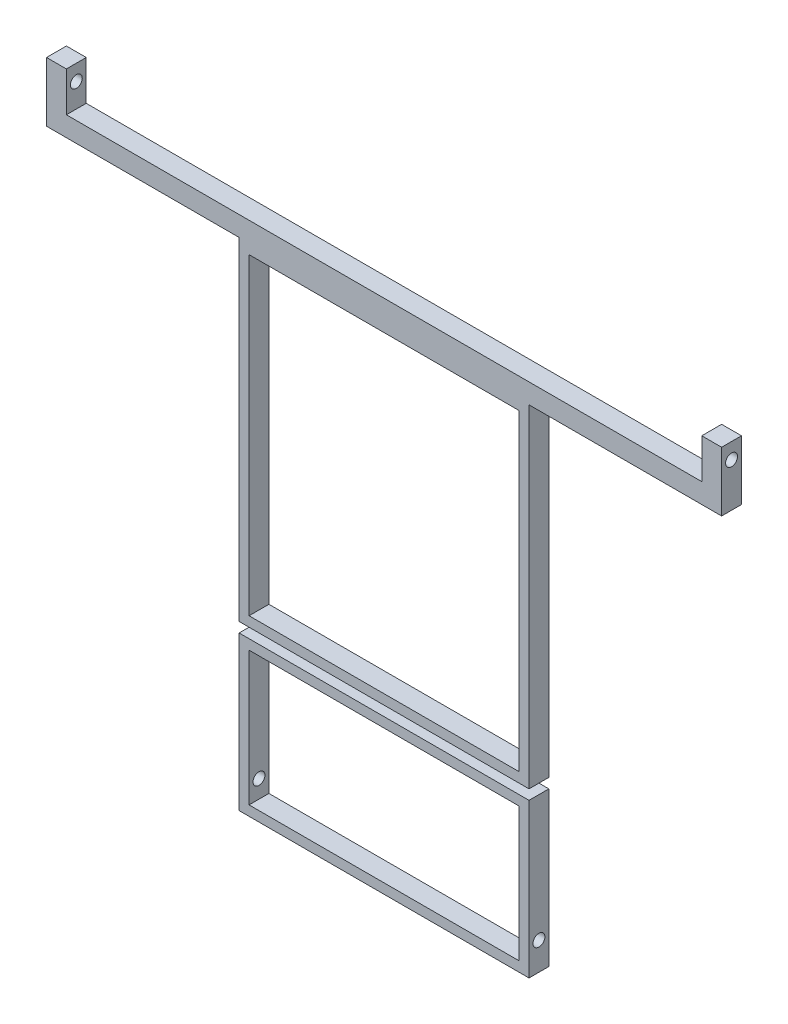
ISO-10303-21;
HEADER;
FILE_DESCRIPTION(('STEP AP214'),'2;1');
FILE_NAME('part.step','',(''),(''),'','','');
FILE_SCHEMA(('AUTOMOTIVE_DESIGN { 1 0 10303 214 1 1 1 1 }'));
ENDSEC;
DATA;
#1=APPLICATION_CONTEXT('core data for automotive mechanical design processes');
#2=APPLICATION_PROTOCOL_DEFINITION('international standard','automotive_design',2000,#1);
#3=PRODUCT_CONTEXT('',#1,'mechanical');
#4=PRODUCT('Part','Part','',(#3));
#5=PRODUCT_RELATED_PRODUCT_CATEGORY('part','',(#4));
#6=PRODUCT_DEFINITION_FORMATION('','',#4);
#7=PRODUCT_DEFINITION_CONTEXT('part definition',#1,'design');
#8=PRODUCT_DEFINITION('design','',#6,#7);
#9=PRODUCT_DEFINITION_SHAPE('','',#8);
#10=(LENGTH_UNIT() NAMED_UNIT(*) SI_UNIT(.MILLI.,.METRE.));
#11=(NAMED_UNIT(*) PLANE_ANGLE_UNIT() SI_UNIT($,.RADIAN.));
#12=(NAMED_UNIT(*) SI_UNIT($,.STERADIAN.) SOLID_ANGLE_UNIT());
#13=UNCERTAINTY_MEASURE_WITH_UNIT(LENGTH_MEASURE(1.E-05),#10,'distance_accuracy_value','');
#14=(GEOMETRIC_REPRESENTATION_CONTEXT(3) GLOBAL_UNCERTAINTY_ASSIGNED_CONTEXT((#13)) GLOBAL_UNIT_ASSIGNED_CONTEXT((#10,
#11,#12)) REPRESENTATION_CONTEXT('',''));
#15=CARTESIAN_POINT('',(0.,0.,0.));
#16=DIRECTION('',(0.,0.,1.));
#17=DIRECTION('',(1.,0.,0.));
#18=AXIS2_PLACEMENT_3D('',#15,#16,#17);
#19=CARTESIAN_POINT('',(0.,0.,25.));
#20=DIRECTION('',(0.,0.,1.));
#21=DIRECTION('',(1.,0.,0.));
#22=AXIS2_PLACEMENT_3D('',#19,#20,#21);
#23=PLANE('',#22);
#24=DIRECTION('',(-1.,0.,0.));
#25=VECTOR('',#24,1.);
#26=CARTESIAN_POINT('',(197.02687563104,-443.762397122992,25.));
#27=LINE('',#26,#25);
#28=CARTESIAN_POINT('',(582.5,-443.762397122992,25.));
#29=VERTEX_POINT('',#28);
#30=CARTESIAN_POINT('',(217.5,-443.762397122992,25.));
#31=VERTEX_POINT('',#30);
#32=EDGE_CURVE('E12',#29,#31,#27,.T.);
#33=ORIENTED_EDGE('',*,*,#32,.F.);
#34=DIRECTION('',(0.,1.,0.));
#35=VECTOR('',#34,1.);
#36=CARTESIAN_POINT('',(582.5,-650.,25.));
#37=LINE('',#36,#35);
#38=CARTESIAN_POINT('',(582.5,-25.,25.));
#39=VERTEX_POINT('',#38);
#40=EDGE_CURVE('E164',#29,#39,#37,.T.);
#41=ORIENTED_EDGE('',*,*,#40,.T.);
#42=DIRECTION('',(1.,0.,0.));
#43=VECTOR('',#42,1.);
#44=CARTESIAN_POINT('',(825.,-25.,25.));
#45=LINE('',#44,#43);
#46=CARTESIAN_POINT('',(825.,-25.,25.));
#47=VERTEX_POINT('',#46);
#48=EDGE_CURVE('E172',#39,#47,#45,.T.);
#49=ORIENTED_EDGE('',*,*,#48,.T.);
#50=DIRECTION('',(0.,1.,0.));
#51=VECTOR('',#50,1.);
#52=CARTESIAN_POINT('',(825.,50.,25.));
#53=LINE('',#52,#51);
#54=CARTESIAN_POINT('',(825.,50.,25.));
#55=VERTEX_POINT('',#54);
#56=EDGE_CURVE('E174',#47,#55,#53,.T.);
#57=ORIENTED_EDGE('',*,*,#56,.T.);
#58=DIRECTION('',(-1.,0.,0.));
#59=VECTOR('',#58,1.);
#60=CARTESIAN_POINT('',(800.,50.,25.));
#61=LINE('',#60,#59);
#62=CARTESIAN_POINT('',(800.,50.,25.));
#63=VERTEX_POINT('',#62);
#64=EDGE_CURVE('E259',#55,#63,#61,.T.);
#65=ORIENTED_EDGE('',*,*,#64,.T.);
#66=DIRECTION('',(0.,-1.,0.));
#67=VECTOR('',#66,1.);
#68=CARTESIAN_POINT('',(800.,0.,25.));
#69=LINE('',#68,#67);
#70=CARTESIAN_POINT('',(800.,0.,25.));
#71=VERTEX_POINT('',#70);
#72=EDGE_CURVE('E261',#63,#71,#69,.T.);
#73=ORIENTED_EDGE('',*,*,#72,.T.);
#74=DIRECTION('',(-1.,0.,0.));
#75=VECTOR('',#74,1.);
#76=CARTESIAN_POINT('',(0.,0.,25.));
#77=LINE('',#76,#75);
#78=CARTESIAN_POINT('',(0.,0.,25.));
#79=VERTEX_POINT('',#78);
#80=EDGE_CURVE('E254',#71,#79,#77,.T.);
#81=ORIENTED_EDGE('',*,*,#80,.T.);
#82=DIRECTION('',(0.,1.,0.));
#83=VECTOR('',#82,1.);
#84=CARTESIAN_POINT('',(0.,50.,25.));
#85=LINE('',#84,#83);
#86=CARTESIAN_POINT('',(0.,50.,25.));
#87=VERTEX_POINT('',#86);
#88=EDGE_CURVE('E250',#79,#87,#85,.T.);
#89=ORIENTED_EDGE('',*,*,#88,.T.);
#90=DIRECTION('',(-1.,0.,0.));
#91=VECTOR('',#90,1.);
#92=CARTESIAN_POINT('',(-25.,50.,25.));
#93=LINE('',#92,#91);
#94=CARTESIAN_POINT('',(-25.,50.,25.));
#95=VERTEX_POINT('',#94);
#96=EDGE_CURVE('E253',#87,#95,#93,.T.);
#97=ORIENTED_EDGE('',*,*,#96,.T.);
#98=DIRECTION('',(0.,-1.,0.));
#99=VECTOR('',#98,1.);
#100=CARTESIAN_POINT('',(-25.,-25.0000000000001,25.));
#101=LINE('',#100,#99);
#102=CARTESIAN_POINT('',(-25.,-25.0000000000001,25.));
#103=VERTEX_POINT('',#102);
#104=EDGE_CURVE('E256',#95,#103,#101,.T.);
#105=ORIENTED_EDGE('',*,*,#104,.T.);
#106=CARTESIAN_POINT('',(217.5,-25.0000000000001,25.));
#107=VERTEX_POINT('',#106);
#108=EDGE_CURVE('E176',#103,#107,#45,.T.);
#109=ORIENTED_EDGE('',*,*,#108,.T.);
#110=DIRECTION('',(0.,1.,0.));
#111=VECTOR('',#110,1.);
#112=CARTESIAN_POINT('',(217.5,-650.,25.));
#113=LINE('',#112,#111);
#114=EDGE_CURVE('E167',#31,#107,#113,.T.);
#115=ORIENTED_EDGE('',*,*,#114,.F.);
#116=EDGE_LOOP('',(#33,#41,#49,#57,#65,#73,#81,#89,#97,#105,#109,#115));
#117=FACE_BOUND('',#116,.T.);
#118=DIRECTION('',(-1.,0.,0.));
#119=VECTOR('',#118,1.);
#120=CARTESIAN_POINT('',(217.5,-431.262397122992,25.));
#121=LINE('',#120,#119);
#122=CARTESIAN_POINT('',(570.,-431.262397122992,25.));
#123=VERTEX_POINT('',#122);
#124=CARTESIAN_POINT('',(230.,-431.262397122992,25.));
#125=VERTEX_POINT('',#124);
#126=EDGE_CURVE('E209',#123,#125,#121,.T.);
#127=ORIENTED_EDGE('',*,*,#126,.T.);
#128=DIRECTION('',(0.,-1.,0.));
#129=VECTOR('',#128,1.);
#130=CARTESIAN_POINT('',(230.,-637.5,25.));
#131=LINE('',#130,#129);
#132=CARTESIAN_POINT('',(230.,-37.5,25.));
#133=VERTEX_POINT('',#132);
#134=EDGE_CURVE('E47',#133,#125,#131,.T.);
#135=ORIENTED_EDGE('',*,*,#134,.F.);
#136=DIRECTION('',(-1.,0.,0.));
#137=VECTOR('',#136,1.);
#138=CARTESIAN_POINT('',(230.,-37.5,25.));
#139=LINE('',#138,#137);
#140=CARTESIAN_POINT('',(570.,-37.5,25.));
#141=VERTEX_POINT('',#140);
#142=EDGE_CURVE('E203',#141,#133,#139,.T.);
#143=ORIENTED_EDGE('',*,*,#142,.F.);
#144=DIRECTION('',(0.,1.,0.));
#145=VECTOR('',#144,1.);
#146=CARTESIAN_POINT('',(570.,-637.5,25.));
#147=LINE('',#146,#145);
#148=EDGE_CURVE('E180',#123,#141,#147,.T.);
#149=ORIENTED_EDGE('',*,*,#148,.F.);
#150=EDGE_LOOP('',(#127,#135,#143,#149));
#151=FACE_BOUND('',#150,.T.);
#152=ADVANCED_FACE('F44',(#117,#151),#23,.T.);
#153=CARTESIAN_POINT('',(0.,0.,0.));
#154=DIRECTION('',(0.,0.,1.));
#155=DIRECTION('',(1.,0.,0.));
#156=AXIS2_PLACEMENT_3D('',#153,#154,#155);
#157=PLANE('',#156);
#158=DIRECTION('',(0.,-1.,0.));
#159=VECTOR('',#158,1.);
#160=CARTESIAN_POINT('',(230.,0.,0.));
#161=LINE('',#160,#159);
#162=CARTESIAN_POINT('',(230.,-37.5,0.));
#163=VERTEX_POINT('',#162);
#164=CARTESIAN_POINT('',(230.,-431.262397122992,0.));
#165=VERTEX_POINT('',#164);
#166=EDGE_CURVE('E212',#163,#165,#161,.T.);
#167=ORIENTED_EDGE('',*,*,#166,.T.);
#168=DIRECTION('',(-1.,0.,0.));
#169=VECTOR('',#168,1.);
#170=CARTESIAN_POINT('',(217.5,-431.262397122992,0.));
#171=LINE('',#170,#169);
#172=CARTESIAN_POINT('',(570.,-431.262397122992,0.));
#173=VERTEX_POINT('',#172);
#174=EDGE_CURVE('E205',#173,#165,#171,.T.);
#175=ORIENTED_EDGE('',*,*,#174,.F.);
#176=DIRECTION('',(0.,1.,0.));
#177=VECTOR('',#176,1.);
#178=CARTESIAN_POINT('',(570.,0.,0.));
#179=LINE('',#178,#177);
#180=CARTESIAN_POINT('',(570.,-37.5,0.));
#181=VERTEX_POINT('',#180);
#182=EDGE_CURVE('E219',#173,#181,#179,.T.);
#183=ORIENTED_EDGE('',*,*,#182,.T.);
#184=DIRECTION('',(-1.,0.,0.));
#185=VECTOR('',#184,1.);
#186=CARTESIAN_POINT('',(0.,-37.5,0.));
#187=LINE('',#186,#185);
#188=EDGE_CURVE('E216',#181,#163,#187,.T.);
#189=ORIENTED_EDGE('',*,*,#188,.T.);
#190=EDGE_LOOP('',(#167,#175,#183,#189));
#191=FACE_BOUND('',#190,.T.);
#192=DIRECTION('',(0.,1.,0.));
#193=VECTOR('',#192,1.);
#194=CARTESIAN_POINT('',(582.5,-650.,0.));
#195=LINE('',#194,#193);
#196=CARTESIAN_POINT('',(582.5,-443.762397122992,0.));
#197=VERTEX_POINT('',#196);
#198=CARTESIAN_POINT('',(582.5,-25.,0.));
#199=VERTEX_POINT('',#198);
#200=EDGE_CURVE('E158',#197,#199,#195,.T.);
#201=ORIENTED_EDGE('',*,*,#200,.F.);
#202=DIRECTION('',(-1.,0.,0.));
#203=VECTOR('',#202,1.);
#204=CARTESIAN_POINT('',(197.02687563104,-443.762397122992,0.));
#205=LINE('',#204,#203);
#206=CARTESIAN_POINT('',(217.5,-443.762397122992,0.));
#207=VERTEX_POINT('',#206);
#208=EDGE_CURVE('E150',#197,#207,#205,.T.);
#209=ORIENTED_EDGE('',*,*,#208,.T.);
#210=DIRECTION('',(0.,1.,0.));
#211=VECTOR('',#210,1.);
#212=CARTESIAN_POINT('',(217.5,-650.,0.));
#213=LINE('',#212,#211);
#214=CARTESIAN_POINT('',(217.5,-25.0000000000001,0.));
#215=VERTEX_POINT('',#214);
#216=EDGE_CURVE('E213',#207,#215,#213,.T.);
#217=ORIENTED_EDGE('',*,*,#216,.T.);
#218=DIRECTION('',(1.,0.,0.));
#219=VECTOR('',#218,1.);
#220=CARTESIAN_POINT('',(825.,-25.,0.));
#221=LINE('',#220,#219);
#222=CARTESIAN_POINT('',(-25.,-25.0000000000001,0.));
#223=VERTEX_POINT('',#222);
#224=EDGE_CURVE('E188',#223,#215,#221,.T.);
#225=ORIENTED_EDGE('',*,*,#224,.F.);
#226=DIRECTION('',(0.,-1.,0.));
#227=VECTOR('',#226,1.);
#228=CARTESIAN_POINT('',(-25.,-25.0000000000001,0.));
#229=LINE('',#228,#227);
#230=CARTESIAN_POINT('',(-25.,50.,0.));
#231=VERTEX_POINT('',#230);
#232=EDGE_CURVE('E244',#231,#223,#229,.T.);
#233=ORIENTED_EDGE('',*,*,#232,.F.);
#234=DIRECTION('',(-1.,0.,0.));
#235=VECTOR('',#234,1.);
#236=CARTESIAN_POINT('',(-25.,50.,0.));
#237=LINE('',#236,#235);
#238=CARTESIAN_POINT('',(0.,50.,0.));
#239=VERTEX_POINT('',#238);
#240=EDGE_CURVE('E267',#239,#231,#237,.T.);
#241=ORIENTED_EDGE('',*,*,#240,.F.);
#242=DIRECTION('',(0.,1.,0.));
#243=VECTOR('',#242,1.);
#244=CARTESIAN_POINT('',(0.,50.,0.));
#245=LINE('',#244,#243);
#246=CARTESIAN_POINT('',(0.,0.,0.));
#247=VERTEX_POINT('',#246);
#248=EDGE_CURVE('E249',#247,#239,#245,.T.);
#249=ORIENTED_EDGE('',*,*,#248,.F.);
#250=DIRECTION('',(-1.,0.,0.));
#251=VECTOR('',#250,1.);
#252=CARTESIAN_POINT('',(0.,0.,0.));
#253=LINE('',#252,#251);
#254=CARTESIAN_POINT('',(800.,0.,0.));
#255=VERTEX_POINT('',#254);
#256=EDGE_CURVE('E281',#255,#247,#253,.T.);
#257=ORIENTED_EDGE('',*,*,#256,.F.);
#258=DIRECTION('',(0.,-1.,0.));
#259=VECTOR('',#258,1.);
#260=CARTESIAN_POINT('',(800.,0.,0.));
#261=LINE('',#260,#259);
#262=CARTESIAN_POINT('',(800.,50.,0.));
#263=VERTEX_POINT('',#262);
#264=EDGE_CURVE('E277',#263,#255,#261,.T.);
#265=ORIENTED_EDGE('',*,*,#264,.F.);
#266=DIRECTION('',(-1.,0.,0.));
#267=VECTOR('',#266,1.);
#268=CARTESIAN_POINT('',(800.,50.,0.));
#269=LINE('',#268,#267);
#270=CARTESIAN_POINT('',(825.,50.,0.));
#271=VERTEX_POINT('',#270);
#272=EDGE_CURVE('E274',#271,#263,#269,.T.);
#273=ORIENTED_EDGE('',*,*,#272,.F.);
#274=DIRECTION('',(0.,1.,0.));
#275=VECTOR('',#274,1.);
#276=CARTESIAN_POINT('',(825.,50.,0.));
#277=LINE('',#276,#275);
#278=CARTESIAN_POINT('',(825.,-25.,0.));
#279=VERTEX_POINT('',#278);
#280=EDGE_CURVE('E271',#279,#271,#277,.T.);
#281=ORIENTED_EDGE('',*,*,#280,.F.);
#282=EDGE_CURVE('E233',#199,#279,#221,.T.);
#283=ORIENTED_EDGE('',*,*,#282,.F.);
#284=EDGE_LOOP('',(#201,#209,#217,#225,#233,#241,#249,#257,#265,#273,#281,#283));
#285=FACE_BOUND('',#284,.T.);
#286=ADVANCED_FACE('F224',(#191,#285),#157,.F.);
#287=CARTESIAN_POINT('',(217.5,-650.,25.));
#288=DIRECTION('',(1.,0.,0.));
#289=DIRECTION('',(0.,1.,0.));
#290=AXIS2_PLACEMENT_3D('',#287,#288,#289);
#291=PLANE('',#290);
#292=ORIENTED_EDGE('',*,*,#216,.F.);
#293=DIRECTION('',(0.,0.,1.));
#294=VECTOR('',#293,1.);
#295=CARTESIAN_POINT('',(217.5,-443.762397122992,25.));
#296=LINE('',#295,#294);
#297=EDGE_CURVE('E61',#207,#31,#296,.T.);
#298=ORIENTED_EDGE('',*,*,#297,.T.);
#299=ORIENTED_EDGE('',*,*,#114,.T.);
#300=DIRECTION('',(0.,0.,-1.));
#301=VECTOR('',#300,1.);
#302=CARTESIAN_POINT('',(217.5,-25.0000000000001,25.));
#303=LINE('',#302,#301);
#304=EDGE_CURVE('E159',#107,#215,#303,.T.);
#305=ORIENTED_EDGE('',*,*,#304,.T.);
#306=EDGE_LOOP('',(#292,#298,#299,#305));
#307=FACE_BOUND('',#306,.T.);
#308=ADVANCED_FACE('F235',(#307),#291,.F.);
#309=CARTESIAN_POINT('',(582.5,-650.,25.));
#310=DIRECTION('',(-1.,0.,0.));
#311=DIRECTION('',(0.,-1.,0.));
#312=AXIS2_PLACEMENT_3D('',#309,#310,#311);
#313=PLANE('',#312);
#314=ORIENTED_EDGE('',*,*,#40,.F.);
#315=DIRECTION('',(0.,0.,-1.));
#316=VECTOR('',#315,1.);
#317=CARTESIAN_POINT('',(582.5,-443.762397122992,25.));
#318=LINE('',#317,#316);
#319=EDGE_CURVE('E152',#29,#197,#318,.T.);
#320=ORIENTED_EDGE('',*,*,#319,.T.);
#321=ORIENTED_EDGE('',*,*,#200,.T.);
#322=DIRECTION('',(0.,0.,1.));
#323=VECTOR('',#322,1.);
#324=CARTESIAN_POINT('',(582.5,-25.,25.));
#325=LINE('',#324,#323);
#326=EDGE_CURVE('E171',#199,#39,#325,.T.);
#327=ORIENTED_EDGE('',*,*,#326,.T.);
#328=EDGE_LOOP('',(#314,#320,#321,#327));
#329=FACE_BOUND('',#328,.T.);
#330=ADVANCED_FACE('F169',(#329),#313,.F.);
#331=CARTESIAN_POINT('',(230.,-637.5,-600.));
#332=DIRECTION('',(-1.,0.,0.));
#333=DIRECTION('',(0.,0.,1.));
#334=AXIS2_PLACEMENT_3D('',#331,#332,#333);
#335=PLANE('',#334);
#336=DIRECTION('',(0.,0.,1.));
#337=VECTOR('',#336,1.);
#338=CARTESIAN_POINT('',(230.,-431.262397122992,-600.));
#339=LINE('',#338,#337);
#340=EDGE_CURVE('E206',#165,#125,#339,.T.);
#341=ORIENTED_EDGE('',*,*,#340,.F.);
#342=ORIENTED_EDGE('',*,*,#166,.F.);
#343=DIRECTION('',(0.,0.,1.));
#344=VECTOR('',#343,1.);
#345=CARTESIAN_POINT('',(230.,-37.5,-600.));
#346=LINE('',#345,#344);
#347=EDGE_CURVE('E191',#163,#133,#346,.T.);
#348=ORIENTED_EDGE('',*,*,#347,.T.);
#349=ORIENTED_EDGE('',*,*,#134,.T.);
#350=EDGE_LOOP('',(#341,#342,#348,#349));
#351=FACE_BOUND('',#350,.T.);
#352=ADVANCED_FACE('F322',(#351),#335,.F.);
#353=CARTESIAN_POINT('',(570.,-637.5,-600.));
#354=DIRECTION('',(1.,0.,0.));
#355=DIRECTION('',(0.,0.,-1.));
#356=AXIS2_PLACEMENT_3D('',#353,#354,#355);
#357=PLANE('',#356);
#358=DIRECTION('',(0.,0.,-1.));
#359=VECTOR('',#358,1.);
#360=CARTESIAN_POINT('',(570.,-431.262397122992,-600.));
#361=LINE('',#360,#359);
#362=EDGE_CURVE('E53',#123,#173,#361,.T.);
#363=ORIENTED_EDGE('',*,*,#362,.F.);
#364=ORIENTED_EDGE('',*,*,#148,.T.);
#365=DIRECTION('',(0.,0.,1.));
#366=VECTOR('',#365,1.);
#367=CARTESIAN_POINT('',(570.,-37.5,-600.));
#368=LINE('',#367,#366);
#369=EDGE_CURVE('E201',#181,#141,#368,.T.);
#370=ORIENTED_EDGE('',*,*,#369,.F.);
#371=ORIENTED_EDGE('',*,*,#182,.F.);
#372=EDGE_LOOP('',(#363,#364,#370,#371));
#373=FACE_BOUND('',#372,.T.);
#374=ADVANCED_FACE('F305',(#373),#357,.F.);
#375=CARTESIAN_POINT('',(825.,-25.,25.));
#376=DIRECTION('',(0.,1.,0.));
#377=DIRECTION('',(-1.,0.,0.));
#378=AXIS2_PLACEMENT_3D('',#375,#376,#377);
#379=PLANE('',#378);
#380=ORIENTED_EDGE('',*,*,#304,.F.);
#381=ORIENTED_EDGE('',*,*,#108,.F.);
#382=DIRECTION('',(0.,0.,-1.));
#383=VECTOR('',#382,1.);
#384=CARTESIAN_POINT('',(-25.,-25.0000000000001,25.));
#385=LINE('',#384,#383);
#386=EDGE_CURVE('E181',#103,#223,#385,.T.);
#387=ORIENTED_EDGE('',*,*,#386,.T.);
#388=ORIENTED_EDGE('',*,*,#224,.T.);
#389=EDGE_LOOP('',(#380,#381,#387,#388));
#390=FACE_BOUND('',#389,.T.);
#391=ADVANCED_FACE('F230',(#390),#379,.F.);
#392=ORIENTED_EDGE('',*,*,#326,.F.);
#393=ORIENTED_EDGE('',*,*,#282,.T.);
#394=DIRECTION('',(0.,0.,-1.));
#395=VECTOR('',#394,1.);
#396=CARTESIAN_POINT('',(825.,-25.,25.));
#397=LINE('',#396,#395);
#398=EDGE_CURVE('E273',#47,#279,#397,.T.);
#399=ORIENTED_EDGE('',*,*,#398,.F.);
#400=ORIENTED_EDGE('',*,*,#48,.F.);
#401=EDGE_LOOP('',(#392,#393,#399,#400));
#402=FACE_BOUND('',#401,.T.);
#403=ADVANCED_FACE('F357',(#402),#379,.F.);
#404=CARTESIAN_POINT('',(0.,50.,25.));
#405=DIRECTION('',(-1.,0.,0.));
#406=DIRECTION('',(0.,0.,1.));
#407=AXIS2_PLACEMENT_3D('',#404,#405,#406);
#408=PLANE('',#407);
#409=CARTESIAN_POINT('',(0.,30.0000000000013,12.5));
#410=DIRECTION('',(-1.,0.,0.));
#411=DIRECTION('',(0.,0.,1.));
#412=AXIS2_PLACEMENT_3D('',#409,#410,#411);
#413=CIRCLE('',#412,7.5);
#414=CARTESIAN_POINT('',(0.,30.0000000000013,20.));
#415=VERTEX_POINT('',#414);
#416=EDGE_CURVE('E246',#415,#415,#413,.T.);
#417=ORIENTED_EDGE('',*,*,#416,.T.);
#418=EDGE_LOOP('',(#417));
#419=FACE_BOUND('',#418,.T.);
#420=ORIENTED_EDGE('',*,*,#248,.T.);
#421=DIRECTION('',(0.,0.,-1.));
#422=VECTOR('',#421,1.);
#423=CARTESIAN_POINT('',(0.,50.,25.));
#424=LINE('',#423,#422);
#425=EDGE_CURVE('E245',#87,#239,#424,.T.);
#426=ORIENTED_EDGE('',*,*,#425,.F.);
#427=ORIENTED_EDGE('',*,*,#88,.F.);
#428=DIRECTION('',(0.,0.,-1.));
#429=VECTOR('',#428,1.);
#430=CARTESIAN_POINT('',(0.,0.,25.));
#431=LINE('',#430,#429);
#432=EDGE_CURVE('E266',#79,#247,#431,.T.);
#433=ORIENTED_EDGE('',*,*,#432,.T.);
#434=EDGE_LOOP('',(#420,#426,#427,#433));
#435=FACE_BOUND('',#434,.T.);
#436=ADVANCED_FACE('F364',(#419,#435),#408,.F.);
#437=CARTESIAN_POINT('',(-25.,50.,25.));
#438=DIRECTION('',(0.,-1.,0.));
#439=DIRECTION('',(0.,0.,-1.));
#440=AXIS2_PLACEMENT_3D('',#437,#438,#439);
#441=PLANE('',#440);
#442=ORIENTED_EDGE('',*,*,#240,.T.);
#443=DIRECTION('',(0.,0.,-1.));
#444=VECTOR('',#443,1.);
#445=CARTESIAN_POINT('',(-25.,50.,25.));
#446=LINE('',#445,#444);
#447=EDGE_CURVE('E269',#95,#231,#446,.T.);
#448=ORIENTED_EDGE('',*,*,#447,.F.);
#449=ORIENTED_EDGE('',*,*,#96,.F.);
#450=ORIENTED_EDGE('',*,*,#425,.T.);
#451=EDGE_LOOP('',(#442,#448,#449,#450));
#452=FACE_BOUND('',#451,.T.);
#453=ADVANCED_FACE('F360',(#452),#441,.F.);
#454=CARTESIAN_POINT('',(-25.,-25.0000000000001,25.));
#455=DIRECTION('',(1.,0.,0.));
#456=DIRECTION('',(0.,0.,-1.));
#457=AXIS2_PLACEMENT_3D('',#454,#455,#456);
#458=PLANE('',#457);
#459=CARTESIAN_POINT('',(-25.0000000000004,30.0000000000013,12.5));
#460=DIRECTION('',(1.,0.,0.));
#461=DIRECTION('',(0.,0.,-1.));
#462=AXIS2_PLACEMENT_3D('',#459,#460,#461);
#463=CIRCLE('',#462,7.5);
#464=CARTESIAN_POINT('',(-25.0000000000004,30.0000000000013,5.));
#465=VERTEX_POINT('',#464);
#466=EDGE_CURVE('E241',#465,#465,#463,.T.);
#467=ORIENTED_EDGE('',*,*,#466,.T.);
#468=EDGE_LOOP('',(#467));
#469=FACE_BOUND('',#468,.T.);
#470=ORIENTED_EDGE('',*,*,#232,.T.);
#471=ORIENTED_EDGE('',*,*,#386,.F.);
#472=ORIENTED_EDGE('',*,*,#104,.F.);
#473=ORIENTED_EDGE('',*,*,#447,.T.);
#474=EDGE_LOOP('',(#470,#471,#472,#473));
#475=FACE_BOUND('',#474,.T.);
#476=ADVANCED_FACE('F353',(#469,#475),#458,.F.);
#477=CARTESIAN_POINT('',(825.,50.,25.));
#478=DIRECTION('',(-1.,0.,0.));
#479=DIRECTION('',(0.,-1.,0.));
#480=AXIS2_PLACEMENT_3D('',#477,#478,#479);
#481=PLANE('',#480);
#482=CARTESIAN_POINT('',(825.,30.,12.5));
#483=DIRECTION('',(1.,0.,0.));
#484=DIRECTION('',(0.,1.,0.));
#485=AXIS2_PLACEMENT_3D('',#482,#483,#484);
#486=CIRCLE('',#485,7.5);
#487=CARTESIAN_POINT('',(825.,37.5,12.5));
#488=VERTEX_POINT('',#487);
#489=EDGE_CURVE('E237',#488,#488,#486,.T.);
#490=ORIENTED_EDGE('',*,*,#489,.F.);
#491=EDGE_LOOP('',(#490));
#492=FACE_BOUND('',#491,.T.);
#493=ORIENTED_EDGE('',*,*,#280,.T.);
#494=DIRECTION('',(0.,0.,-1.));
#495=VECTOR('',#494,1.);
#496=CARTESIAN_POINT('',(825.,50.,25.));
#497=LINE('',#496,#495);
#498=EDGE_CURVE('E276',#55,#271,#497,.T.);
#499=ORIENTED_EDGE('',*,*,#498,.F.);
#500=ORIENTED_EDGE('',*,*,#56,.F.);
#501=ORIENTED_EDGE('',*,*,#398,.T.);
#502=EDGE_LOOP('',(#493,#499,#500,#501));
#503=FACE_BOUND('',#502,.T.);
#504=ADVANCED_FACE('F349',(#492,#503),#481,.F.);
#505=CARTESIAN_POINT('',(800.,50.,25.));
#506=DIRECTION('',(0.,-1.,0.));
#507=DIRECTION('',(0.,0.,-1.));
#508=AXIS2_PLACEMENT_3D('',#505,#506,#507);
#509=PLANE('',#508);
#510=ORIENTED_EDGE('',*,*,#272,.T.);
#511=DIRECTION('',(0.,0.,-1.));
#512=VECTOR('',#511,1.);
#513=CARTESIAN_POINT('',(800.,50.,25.));
#514=LINE('',#513,#512);
#515=EDGE_CURVE('E279',#63,#263,#514,.T.);
#516=ORIENTED_EDGE('',*,*,#515,.F.);
#517=ORIENTED_EDGE('',*,*,#64,.F.);
#518=ORIENTED_EDGE('',*,*,#498,.T.);
#519=EDGE_LOOP('',(#510,#516,#517,#518));
#520=FACE_BOUND('',#519,.T.);
#521=ADVANCED_FACE('F345',(#520),#509,.F.);
#522=CARTESIAN_POINT('',(800.,0.,25.));
#523=DIRECTION('',(1.,0.,0.));
#524=DIRECTION('',(0.,0.,-1.));
#525=AXIS2_PLACEMENT_3D('',#522,#523,#524);
#526=PLANE('',#525);
#527=CARTESIAN_POINT('',(800.000000000001,30.0000000000001,12.5));
#528=DIRECTION('',(1.,0.,0.));
#529=DIRECTION('',(0.,0.,-1.));
#530=AXIS2_PLACEMENT_3D('',#527,#528,#529);
#531=CIRCLE('',#530,7.5);
#532=CARTESIAN_POINT('',(800.000000000001,30.0000000000001,5.));
#533=VERTEX_POINT('',#532);
#534=EDGE_CURVE('E280',#533,#533,#531,.T.);
#535=ORIENTED_EDGE('',*,*,#534,.T.);
#536=EDGE_LOOP('',(#535));
#537=FACE_BOUND('',#536,.T.);
#538=ORIENTED_EDGE('',*,*,#264,.T.);
#539=DIRECTION('',(0.,0.,-1.));
#540=VECTOR('',#539,1.);
#541=CARTESIAN_POINT('',(800.,0.,25.));
#542=LINE('',#541,#540);
#543=EDGE_CURVE('E240',#71,#255,#542,.T.);
#544=ORIENTED_EDGE('',*,*,#543,.F.);
#545=ORIENTED_EDGE('',*,*,#72,.F.);
#546=ORIENTED_EDGE('',*,*,#515,.T.);
#547=EDGE_LOOP('',(#538,#544,#545,#546));
#548=FACE_BOUND('',#547,.T.);
#549=ADVANCED_FACE('F341',(#537,#548),#526,.F.);
#550=CARTESIAN_POINT('',(0.,0.,25.));
#551=DIRECTION('',(0.,-1.,0.));
#552=DIRECTION('',(0.,0.,-1.));
#553=AXIS2_PLACEMENT_3D('',#550,#551,#552);
#554=PLANE('',#553);
#555=ORIENTED_EDGE('',*,*,#256,.T.);
#556=ORIENTED_EDGE('',*,*,#432,.F.);
#557=ORIENTED_EDGE('',*,*,#80,.F.);
#558=ORIENTED_EDGE('',*,*,#543,.T.);
#559=EDGE_LOOP('',(#555,#556,#557,#558));
#560=FACE_BOUND('',#559,.T.);
#561=ADVANCED_FACE('F338',(#560),#554,.F.);
#562=CARTESIAN_POINT('',(-9175.,30.0000000000148,12.5));
#563=DIRECTION('',(1.,0.,0.));
#564=DIRECTION('',(0.,1.,0.));
#565=AXIS2_PLACEMENT_3D('',#562,#563,#564);
#566=CYLINDRICAL_SURFACE('',#565,7.5);
#567=ORIENTED_EDGE('',*,*,#489,.T.);
#568=EDGE_LOOP('',(#567));
#569=FACE_BOUND('',#568,.T.);
#570=ORIENTED_EDGE('',*,*,#534,.F.);
#571=EDGE_LOOP('',(#570));
#572=FACE_BOUND('',#571,.T.);
#573=ADVANCED_FACE('F336',(#569,#572),#566,.F.);
#574=ORIENTED_EDGE('',*,*,#466,.F.);
#575=EDGE_LOOP('',(#574));
#576=FACE_BOUND('',#575,.T.);
#577=ORIENTED_EDGE('',*,*,#416,.F.);
#578=EDGE_LOOP('',(#577));
#579=FACE_BOUND('',#578,.T.);
#580=ADVANCED_FACE('F333',(#576,#579),#566,.F.);
#581=CARTESIAN_POINT('',(230.,-37.5,-600.));
#582=DIRECTION('',(0.,1.,0.));
#583=DIRECTION('',(-1.,0.,0.));
#584=AXIS2_PLACEMENT_3D('',#581,#582,#583);
#585=PLANE('',#584);
#586=ORIENTED_EDGE('',*,*,#369,.T.);
#587=ORIENTED_EDGE('',*,*,#142,.T.);
#588=ORIENTED_EDGE('',*,*,#347,.F.);
#589=ORIENTED_EDGE('',*,*,#188,.F.);
#590=EDGE_LOOP('',(#586,#587,#588,#589));
#591=FACE_BOUND('',#590,.T.);
#592=ADVANCED_FACE('F309',(#591),#585,.F.);
#593=CARTESIAN_POINT('',(217.5,-431.262397122992,25.));
#594=DIRECTION('',(0.,-1.,0.));
#595=DIRECTION('',(0.,0.,-1.));
#596=AXIS2_PLACEMENT_3D('',#593,#594,#595);
#597=PLANE('',#596);
#598=ORIENTED_EDGE('',*,*,#174,.T.);
#599=ORIENTED_EDGE('',*,*,#340,.T.);
#600=ORIENTED_EDGE('',*,*,#126,.F.);
#601=ORIENTED_EDGE('',*,*,#362,.T.);
#602=EDGE_LOOP('',(#598,#599,#600,#601));
#603=FACE_BOUND('',#602,.T.);
#604=ADVANCED_FACE('F304',(#603),#597,.F.);
#605=CARTESIAN_POINT('',(197.02687563104,-443.762397122992,0.));
#606=DIRECTION('',(0.,1.,0.));
#607=DIRECTION('',(0.,0.,1.));
#608=AXIS2_PLACEMENT_3D('',#605,#606,#607);
#609=PLANE('',#608);
#610=ORIENTED_EDGE('',*,*,#208,.F.);
#611=ORIENTED_EDGE('',*,*,#319,.F.);
#612=ORIENTED_EDGE('',*,*,#32,.T.);
#613=ORIENTED_EDGE('',*,*,#297,.F.);
#614=EDGE_LOOP('',(#610,#611,#612,#613));
#615=FACE_BOUND('',#614,.T.);
#616=ADVANCED_FACE('F154',(#615),#609,.F.);
#617=CLOSED_SHELL('',(#152,#286,#308,#330,#352,#374,#391,#403,#436,#453,#476,#504,#521,#549,
#561,#573,#580,#592,#604,#616));
#618=MANIFOLD_SOLID_BREP('B2',#617);
#619=CARTESIAN_POINT('',(230.,-637.5,-600.));
#620=DIRECTION('',(0.,-1.,0.));
#621=DIRECTION('',(0.,0.,-1.));
#622=AXIS2_PLACEMENT_3D('',#619,#620,#621);
#623=PLANE('',#622);
#624=DIRECTION('',(0.,0.,1.));
#625=VECTOR('',#624,1.);
#626=CARTESIAN_POINT('',(230.,-637.5,-600.));
#627=LINE('',#626,#625);
#628=CARTESIAN_POINT('',(230.,-637.5,0.));
#629=VERTEX_POINT('',#628);
#630=CARTESIAN_POINT('',(230.,-637.5,25.));
#631=VERTEX_POINT('',#630);
#632=EDGE_CURVE('E657',#629,#631,#627,.T.);
#633=ORIENTED_EDGE('',*,*,#632,.T.);
#634=DIRECTION('',(1.,0.,0.));
#635=VECTOR('',#634,1.);
#636=CARTESIAN_POINT('',(230.,-637.5,25.));
#637=LINE('',#636,#635);
#638=CARTESIAN_POINT('',(570.,-637.5,25.));
#639=VERTEX_POINT('',#638);
#640=EDGE_CURVE('E658',#631,#639,#637,.T.);
#641=ORIENTED_EDGE('',*,*,#640,.T.);
#642=DIRECTION('',(0.,0.,1.));
#643=VECTOR('',#642,1.);
#644=CARTESIAN_POINT('',(570.,-637.5,-600.));
#645=LINE('',#644,#643);
#646=CARTESIAN_POINT('',(570.,-637.5,0.));
#647=VERTEX_POINT('',#646);
#648=EDGE_CURVE('E655',#647,#639,#645,.T.);
#649=ORIENTED_EDGE('',*,*,#648,.F.);
#650=DIRECTION('',(1.,0.,0.));
#651=VECTOR('',#650,1.);
#652=CARTESIAN_POINT('',(0.,-637.5,0.));
#653=LINE('',#652,#651);
#654=EDGE_CURVE('E631',#629,#647,#653,.T.);
#655=ORIENTED_EDGE('',*,*,#654,.F.);
#656=EDGE_LOOP('',(#633,#641,#649,#655));
#657=FACE_BOUND('',#656,.T.);
#658=ADVANCED_FACE('F532',(#657),#623,.F.);
#659=CARTESIAN_POINT('',(230.,-637.5,-600.));
#660=DIRECTION('',(-1.,0.,0.));
#661=DIRECTION('',(0.,0.,1.));
#662=AXIS2_PLACEMENT_3D('',#659,#660,#661);
#663=PLANE('',#662);
#664=CARTESIAN_POINT('',(230.,-615.,12.5));
#665=DIRECTION('',(-1.,0.,0.));
#666=DIRECTION('',(0.,0.,1.));
#667=AXIS2_PLACEMENT_3D('',#664,#665,#666);
#668=CIRCLE('',#667,7.5);
#669=CARTESIAN_POINT('',(230.,-615.,20.));
#670=VERTEX_POINT('',#669);
#671=EDGE_CURVE('E614',#670,#670,#668,.T.);
#672=ORIENTED_EDGE('',*,*,#671,.T.);
#673=EDGE_LOOP('',(#672));
#674=FACE_BOUND('',#673,.T.);
#675=DIRECTION('',(0.,0.,-1.));
#676=VECTOR('',#675,1.);
#677=CARTESIAN_POINT('',(230.,-468.762397122992,-600.));
#678=LINE('',#677,#676);
#679=CARTESIAN_POINT('',(230.,-468.762397122992,25.));
#680=VERTEX_POINT('',#679);
#681=CARTESIAN_POINT('',(230.,-468.762397122992,0.));
#682=VERTEX_POINT('',#681);
#683=EDGE_CURVE('E652',#680,#682,#678,.T.);
#684=ORIENTED_EDGE('',*,*,#683,.F.);
#685=DIRECTION('',(0.,-1.,0.));
#686=VECTOR('',#685,1.);
#687=CARTESIAN_POINT('',(230.,-637.5,25.));
#688=LINE('',#687,#686);
#689=EDGE_CURVE('E651',#680,#631,#688,.T.);
#690=ORIENTED_EDGE('',*,*,#689,.T.);
#691=ORIENTED_EDGE('',*,*,#632,.F.);
#692=DIRECTION('',(0.,-1.,0.));
#693=VECTOR('',#692,1.);
#694=CARTESIAN_POINT('',(230.,0.,0.));
#695=LINE('',#694,#693);
#696=EDGE_CURVE('E636',#682,#629,#695,.T.);
#697=ORIENTED_EDGE('',*,*,#696,.F.);
#698=EDGE_LOOP('',(#684,#690,#691,#697));
#699=FACE_BOUND('',#698,.T.);
#700=ADVANCED_FACE('F682',(#674,#699),#663,.F.);
#701=CARTESIAN_POINT('',(217.5,-468.762397122992,25.));
#702=DIRECTION('',(0.,1.,0.));
#703=DIRECTION('',(0.,0.,1.));
#704=AXIS2_PLACEMENT_3D('',#701,#702,#703);
#705=PLANE('',#704);
#706=DIRECTION('',(1.,0.,0.));
#707=VECTOR('',#706,1.);
#708=CARTESIAN_POINT('',(217.5,-468.762397122992,25.));
#709=LINE('',#708,#707);
#710=CARTESIAN_POINT('',(570.,-468.762397122992,25.));
#711=VERTEX_POINT('',#710);
#712=EDGE_CURVE('E642',#680,#711,#709,.T.);
#713=ORIENTED_EDGE('',*,*,#712,.F.);
#714=ORIENTED_EDGE('',*,*,#683,.T.);
#715=DIRECTION('',(1.,0.,0.));
#716=VECTOR('',#715,1.);
#717=CARTESIAN_POINT('',(217.5,-468.762397122992,0.));
#718=LINE('',#717,#716);
#719=CARTESIAN_POINT('',(570.,-468.762397122992,0.));
#720=VERTEX_POINT('',#719);
#721=EDGE_CURVE('E555',#682,#720,#718,.T.);
#722=ORIENTED_EDGE('',*,*,#721,.T.);
#723=DIRECTION('',(0.,0.,1.));
#724=VECTOR('',#723,1.);
#725=CARTESIAN_POINT('',(570.,-468.762397122992,-600.));
#726=LINE('',#725,#724);
#727=EDGE_CURVE('E541',#720,#711,#726,.T.);
#728=ORIENTED_EDGE('',*,*,#727,.T.);
#729=EDGE_LOOP('',(#713,#714,#722,#728));
#730=FACE_BOUND('',#729,.T.);
#731=ADVANCED_FACE('F641',(#730),#705,.F.);
#732=CARTESIAN_POINT('',(570.,-637.5,-600.));
#733=DIRECTION('',(1.,0.,0.));
#734=DIRECTION('',(0.,0.,-1.));
#735=AXIS2_PLACEMENT_3D('',#732,#733,#734);
#736=PLANE('',#735);
#737=CARTESIAN_POINT('',(570.,-615.,12.5));
#738=DIRECTION('',(1.,0.,0.));
#739=DIRECTION('',(0.,0.,-1.));
#740=AXIS2_PLACEMENT_3D('',#737,#738,#739);
#741=CIRCLE('',#740,7.5);
#742=CARTESIAN_POINT('',(570.,-615.,5.));
#743=VERTEX_POINT('',#742);
#744=EDGE_CURVE('E713',#743,#743,#741,.T.);
#745=ORIENTED_EDGE('',*,*,#744,.T.);
#746=EDGE_LOOP('',(#745));
#747=FACE_BOUND('',#746,.T.);
#748=ORIENTED_EDGE('',*,*,#727,.F.);
#749=DIRECTION('',(0.,1.,0.));
#750=VECTOR('',#749,1.);
#751=CARTESIAN_POINT('',(570.,0.,0.));
#752=LINE('',#751,#750);
#753=EDGE_CURVE('E634',#647,#720,#752,.T.);
#754=ORIENTED_EDGE('',*,*,#753,.F.);
#755=ORIENTED_EDGE('',*,*,#648,.T.);
#756=DIRECTION('',(0.,1.,0.));
#757=VECTOR('',#756,1.);
#758=CARTESIAN_POINT('',(570.,-637.5,25.));
#759=LINE('',#758,#757);
#760=EDGE_CURVE('E650',#639,#711,#759,.T.);
#761=ORIENTED_EDGE('',*,*,#760,.T.);
#762=EDGE_LOOP('',(#748,#754,#755,#761));
#763=FACE_BOUND('',#762,.T.);
#764=ADVANCED_FACE('F654',(#747,#763),#736,.F.);
#765=CARTESIAN_POINT('',(0.,-650.,0.));
#766=DIRECTION('',(0.,-1.,0.));
#767=DIRECTION('',(1.,0.,0.));
#768=AXIS2_PLACEMENT_3D('',#765,#766,#767);
#769=PLANE('',#768);
#770=DIRECTION('',(0.,0.,-1.));
#771=VECTOR('',#770,1.);
#772=CARTESIAN_POINT('',(217.5,-650.,25.));
#773=LINE('',#772,#771);
#774=CARTESIAN_POINT('',(217.5,-650.,25.));
#775=VERTEX_POINT('',#774);
#776=CARTESIAN_POINT('',(217.5,-650.,0.));
#777=VERTEX_POINT('',#776);
#778=EDGE_CURVE('E618',#775,#777,#773,.T.);
#779=ORIENTED_EDGE('',*,*,#778,.T.);
#780=DIRECTION('',(1.,0.,0.));
#781=VECTOR('',#780,1.);
#782=CARTESIAN_POINT('',(217.5,-650.,0.));
#783=LINE('',#782,#781);
#784=CARTESIAN_POINT('',(582.5,-650.,0.));
#785=VERTEX_POINT('',#784);
#786=EDGE_CURVE('E667',#777,#785,#783,.T.);
#787=ORIENTED_EDGE('',*,*,#786,.T.);
#788=DIRECTION('',(0.,0.,1.));
#789=VECTOR('',#788,1.);
#790=CARTESIAN_POINT('',(582.5,-650.,25.));
#791=LINE('',#790,#789);
#792=CARTESIAN_POINT('',(582.5,-650.,25.));
#793=VERTEX_POINT('',#792);
#794=EDGE_CURVE('E623',#785,#793,#791,.T.);
#795=ORIENTED_EDGE('',*,*,#794,.T.);
#796=DIRECTION('',(-1.,0.,0.));
#797=VECTOR('',#796,1.);
#798=CARTESIAN_POINT('',(217.5,-650.,25.));
#799=LINE('',#798,#797);
#800=EDGE_CURVE('E619',#793,#775,#799,.T.);
#801=ORIENTED_EDGE('',*,*,#800,.T.);
#802=EDGE_LOOP('',(#779,#787,#795,#801));
#803=FACE_BOUND('',#802,.T.);
#804=ADVANCED_FACE('F670',(#803),#769,.T.);
#805=CARTESIAN_POINT('',(582.5,-650.,25.));
#806=DIRECTION('',(-1.,0.,0.));
#807=DIRECTION('',(0.,-1.,0.));
#808=AXIS2_PLACEMENT_3D('',#805,#806,#807);
#809=PLANE('',#808);
#810=CARTESIAN_POINT('',(582.5,-615.,12.5));
#811=DIRECTION('',(-1.,0.,0.));
#812=DIRECTION('',(0.,-1.,0.));
#813=AXIS2_PLACEMENT_3D('',#810,#811,#812);
#814=CIRCLE('',#813,7.5);
#815=CARTESIAN_POINT('',(582.5,-622.5,12.5));
#816=VERTEX_POINT('',#815);
#817=EDGE_CURVE('E711',#816,#816,#814,.T.);
#818=ORIENTED_EDGE('',*,*,#817,.T.);
#819=EDGE_LOOP('',(#818));
#820=FACE_BOUND('',#819,.T.);
#821=DIRECTION('',(0.,1.,0.));
#822=VECTOR('',#821,1.);
#823=CARTESIAN_POINT('',(582.5,-650.,0.));
#824=LINE('',#823,#822);
#825=CARTESIAN_POINT('',(582.5,-456.262397122992,0.));
#826=VERTEX_POINT('',#825);
#827=EDGE_CURVE('E621',#785,#826,#824,.T.);
#828=ORIENTED_EDGE('',*,*,#827,.T.);
#829=DIRECTION('',(0.,0.,1.));
#830=VECTOR('',#829,1.);
#831=CARTESIAN_POINT('',(582.5,-456.262397122992,25.));
#832=LINE('',#831,#830);
#833=CARTESIAN_POINT('',(582.5,-456.262397122992,25.));
#834=VERTEX_POINT('',#833);
#835=EDGE_CURVE('E42',#826,#834,#832,.T.);
#836=ORIENTED_EDGE('',*,*,#835,.T.);
#837=DIRECTION('',(0.,1.,0.));
#838=VECTOR('',#837,1.);
#839=CARTESIAN_POINT('',(582.5,-650.,25.));
#840=LINE('',#839,#838);
#841=EDGE_CURVE('E613',#793,#834,#840,.T.);
#842=ORIENTED_EDGE('',*,*,#841,.F.);
#843=ORIENTED_EDGE('',*,*,#794,.F.);
#844=EDGE_LOOP('',(#828,#836,#842,#843));
#845=FACE_BOUND('',#844,.T.);
#846=ADVANCED_FACE('F673',(#820,#845),#809,.F.);
#847=CARTESIAN_POINT('',(217.5,-650.,25.));
#848=DIRECTION('',(1.,0.,0.));
#849=DIRECTION('',(0.,1.,0.));
#850=AXIS2_PLACEMENT_3D('',#847,#848,#849);
#851=PLANE('',#850);
#852=CARTESIAN_POINT('',(217.5,-615.,12.5));
#853=DIRECTION('',(1.,0.,0.));
#854=DIRECTION('',(0.,1.,0.));
#855=AXIS2_PLACEMENT_3D('',#852,#853,#854);
#856=CIRCLE('',#855,7.5);
#857=CARTESIAN_POINT('',(217.5,-607.5,12.5));
#858=VERTEX_POINT('',#857);
#859=EDGE_CURVE('E536',#858,#858,#856,.T.);
#860=ORIENTED_EDGE('',*,*,#859,.T.);
#861=EDGE_LOOP('',(#860));
#862=FACE_BOUND('',#861,.T.);
#863=DIRECTION('',(0.,1.,0.));
#864=VECTOR('',#863,1.);
#865=CARTESIAN_POINT('',(217.5,-650.,25.));
#866=LINE('',#865,#864);
#867=CARTESIAN_POINT('',(217.5,-456.262397122992,25.));
#868=VERTEX_POINT('',#867);
#869=EDGE_CURVE('E610',#775,#868,#866,.T.);
#870=ORIENTED_EDGE('',*,*,#869,.T.);
#871=DIRECTION('',(0.,0.,-1.));
#872=VECTOR('',#871,1.);
#873=CARTESIAN_POINT('',(217.5,-456.262397122992,25.));
#874=LINE('',#873,#872);
#875=CARTESIAN_POINT('',(217.5,-456.262397122992,0.));
#876=VERTEX_POINT('',#875);
#877=EDGE_CURVE('E595',#868,#876,#874,.T.);
#878=ORIENTED_EDGE('',*,*,#877,.T.);
#879=DIRECTION('',(0.,1.,0.));
#880=VECTOR('',#879,1.);
#881=CARTESIAN_POINT('',(217.5,-650.,0.));
#882=LINE('',#881,#880);
#883=EDGE_CURVE('E629',#777,#876,#882,.T.);
#884=ORIENTED_EDGE('',*,*,#883,.F.);
#885=ORIENTED_EDGE('',*,*,#778,.F.);
#886=EDGE_LOOP('',(#870,#878,#884,#885));
#887=FACE_BOUND('',#886,.T.);
#888=ADVANCED_FACE('F616',(#862,#887),#851,.F.);
#889=CARTESIAN_POINT('',(0.,0.,0.));
#890=DIRECTION('',(0.,0.,1.));
#891=DIRECTION('',(1.,0.,0.));
#892=AXIS2_PLACEMENT_3D('',#889,#890,#891);
#893=PLANE('',#892);
#894=ORIENTED_EDGE('',*,*,#753,.T.);
#895=ORIENTED_EDGE('',*,*,#721,.F.);
#896=ORIENTED_EDGE('',*,*,#696,.T.);
#897=ORIENTED_EDGE('',*,*,#654,.T.);
#898=EDGE_LOOP('',(#894,#895,#896,#897));
#899=FACE_BOUND('',#898,.T.);
#900=ORIENTED_EDGE('',*,*,#883,.T.);
#901=DIRECTION('',(1.,0.,0.));
#902=VECTOR('',#901,1.);
#903=CARTESIAN_POINT('',(197.02687563104,-456.262397122992,0.));
#904=LINE('',#903,#902);
#905=EDGE_CURVE('E598',#876,#826,#904,.T.);
#906=ORIENTED_EDGE('',*,*,#905,.T.);
#907=ORIENTED_EDGE('',*,*,#827,.F.);
#908=ORIENTED_EDGE('',*,*,#786,.F.);
#909=EDGE_LOOP('',(#900,#906,#907,#908));
#910=FACE_BOUND('',#909,.T.);
#911=ADVANCED_FACE('F534',(#899,#910),#893,.F.);
#912=CARTESIAN_POINT('',(0.,0.,25.));
#913=DIRECTION('',(0.,0.,1.));
#914=DIRECTION('',(1.,0.,0.));
#915=AXIS2_PLACEMENT_3D('',#912,#913,#914);
#916=PLANE('',#915);
#917=DIRECTION('',(1.,0.,0.));
#918=VECTOR('',#917,1.);
#919=CARTESIAN_POINT('',(197.02687563104,-456.262397122992,25.));
#920=LINE('',#919,#918);
#921=EDGE_CURVE('E548',#868,#834,#920,.T.);
#922=ORIENTED_EDGE('',*,*,#921,.F.);
#923=ORIENTED_EDGE('',*,*,#869,.F.);
#924=ORIENTED_EDGE('',*,*,#800,.F.);
#925=ORIENTED_EDGE('',*,*,#841,.T.);
#926=EDGE_LOOP('',(#922,#923,#924,#925));
#927=FACE_BOUND('',#926,.T.);
#928=ORIENTED_EDGE('',*,*,#712,.T.);
#929=ORIENTED_EDGE('',*,*,#760,.F.);
#930=ORIENTED_EDGE('',*,*,#640,.F.);
#931=ORIENTED_EDGE('',*,*,#689,.F.);
#932=EDGE_LOOP('',(#928,#929,#930,#931));
#933=FACE_BOUND('',#932,.T.);
#934=ADVANCED_FACE('F607',(#927,#933),#916,.T.);
#935=CARTESIAN_POINT('',(197.02687563104,-456.262397122992,0.));
#936=DIRECTION('',(0.,-1.,0.));
#937=DIRECTION('',(0.,0.,-1.));
#938=AXIS2_PLACEMENT_3D('',#935,#936,#937);
#939=PLANE('',#938);
#940=ORIENTED_EDGE('',*,*,#921,.T.);
#941=ORIENTED_EDGE('',*,*,#835,.F.);
#942=ORIENTED_EDGE('',*,*,#905,.F.);
#943=ORIENTED_EDGE('',*,*,#877,.F.);
#944=EDGE_LOOP('',(#940,#941,#942,#943));
#945=FACE_BOUND('',#944,.T.);
#946=ADVANCED_FACE('F596',(#945),#939,.F.);
#947=CARTESIAN_POINT('',(825.,-615.,12.5));
#948=DIRECTION('',(-1.,0.,0.));
#949=DIRECTION('',(0.,-1.,0.));
#950=AXIS2_PLACEMENT_3D('',#947,#948,#949);
#951=CYLINDRICAL_SURFACE('',#950,7.5);
#952=ORIENTED_EDGE('',*,*,#859,.F.);
#953=EDGE_LOOP('',(#952));
#954=FACE_BOUND('',#953,.T.);
#955=ORIENTED_EDGE('',*,*,#671,.F.);
#956=EDGE_LOOP('',(#955));
#957=FACE_BOUND('',#956,.T.);
#958=ADVANCED_FACE('F719',(#954,#957),#951,.F.);
#959=ORIENTED_EDGE('',*,*,#817,.F.);
#960=EDGE_LOOP('',(#959));
#961=FACE_BOUND('',#960,.T.);
#962=ORIENTED_EDGE('',*,*,#744,.F.);
#963=EDGE_LOOP('',(#962));
#964=FACE_BOUND('',#963,.T.);
#965=ADVANCED_FACE('F722',(#961,#964),#951,.F.);
#966=CLOSED_SHELL('',(#658,#700,#731,#764,#804,#846,#888,#911,#934,#946,#958,#965));
#967=MANIFOLD_SOLID_BREP('B6',#966);
#968=ADVANCED_BREP_SHAPE_REPRESENTATION('',(#18,#618,#967),#14);
#969=SHAPE_DEFINITION_REPRESENTATION(#9,#968);
ENDSEC;
END-ISO-10303-21;
